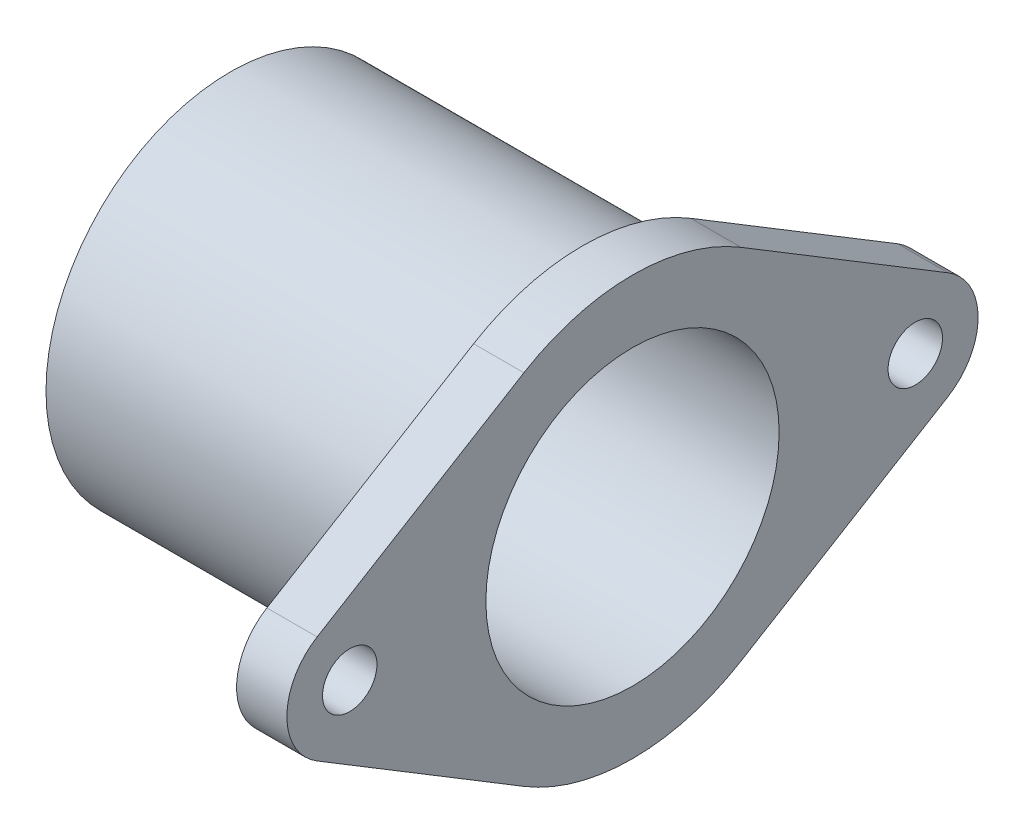
ISO-10303-21;
HEADER;
FILE_DESCRIPTION(('STEP AP214'),'2;1');
FILE_NAME('part.step','',(''),(''),'','','');
FILE_SCHEMA(('AUTOMOTIVE_DESIGN { 1 0 10303 214 1 1 1 1 }'));
ENDSEC;
DATA;
#1=APPLICATION_CONTEXT('core data for automotive mechanical design processes');
#2=APPLICATION_PROTOCOL_DEFINITION('international standard','automotive_design',2000,#1);
#3=PRODUCT_CONTEXT('',#1,'mechanical');
#4=PRODUCT('Part','Part','',(#3));
#5=PRODUCT_RELATED_PRODUCT_CATEGORY('part','',(#4));
#6=PRODUCT_DEFINITION_FORMATION('','',#4);
#7=PRODUCT_DEFINITION_CONTEXT('part definition',#1,'design');
#8=PRODUCT_DEFINITION('design','',#6,#7);
#9=PRODUCT_DEFINITION_SHAPE('','',#8);
#10=(LENGTH_UNIT() NAMED_UNIT(*) SI_UNIT(.MILLI.,.METRE.));
#11=(NAMED_UNIT(*) PLANE_ANGLE_UNIT() SI_UNIT($,.RADIAN.));
#12=(NAMED_UNIT(*) SI_UNIT($,.STERADIAN.) SOLID_ANGLE_UNIT());
#13=UNCERTAINTY_MEASURE_WITH_UNIT(LENGTH_MEASURE(1.E-05),#10,'distance_accuracy_value','');
#14=(GEOMETRIC_REPRESENTATION_CONTEXT(3) GLOBAL_UNCERTAINTY_ASSIGNED_CONTEXT((#13)) GLOBAL_UNIT_ASSIGNED_CONTEXT((#10,
#11,#12)) REPRESENTATION_CONTEXT('',''));
#15=CARTESIAN_POINT('',(0.,0.,0.));
#16=DIRECTION('',(0.,0.,1.));
#17=DIRECTION('',(1.,0.,0.));
#18=AXIS2_PLACEMENT_3D('',#15,#16,#17);
#19=CARTESIAN_POINT('',(84.,0.,0.));
#20=DIRECTION('',(-1.,0.,0.));
#21=DIRECTION('',(0.,0.,0.999999999999999));
#22=AXIS2_PLACEMENT_3D('',#19,#20,#21);
#23=CYLINDRICAL_SURFACE('',#22,44.);
#24=CARTESIAN_POINT('',(84.,0.,0.));
#25=DIRECTION('',(1.,0.,0.));
#26=DIRECTION('',(0.,0.,-0.999999999999999));
#27=AXIS2_PLACEMENT_3D('',#24,#25,#26);
#28=CIRCLE('',#27,44.);
#29=CARTESIAN_POINT('',(84.,0.,44.));
#30=VERTEX_POINT('',#29);
#31=EDGE_CURVE('E11',#30,#30,#28,.T.);
#32=CARTESIAN_POINT('',(0.,0.,0.));
#33=DIRECTION('',(1.,0.,0.));
#34=DIRECTION('',(0.,0.,-0.999999999999999));
#35=AXIS2_PLACEMENT_3D('',#32,#33,#34);
#36=CIRCLE('',#35,44.);
#37=CARTESIAN_POINT('',(0.,0.,44.));
#38=VERTEX_POINT('',#37);
#39=EDGE_CURVE('E43',#38,#38,#36,.T.);
#40=CARTESIAN_POINT('',(84.,0.,44.));
#41=CARTESIAN_POINT('',(83.125,0.,44.));
#42=CARTESIAN_POINT('',(82.25,0.,44.));
#43=CARTESIAN_POINT('',(80.5,0.,44.));
#44=CARTESIAN_POINT('',(79.625,0.,44.));
#45=CARTESIAN_POINT('',(77.875,0.,44.));
#46=CARTESIAN_POINT('',(77.,0.,44.));
#47=CARTESIAN_POINT('',(75.25,0.,44.));
#48=CARTESIAN_POINT('',(74.375,0.,44.));
#49=CARTESIAN_POINT('',(72.625,0.,44.));
#50=CARTESIAN_POINT('',(71.75,0.,44.));
#51=CARTESIAN_POINT('',(70.,0.,44.));
#52=CARTESIAN_POINT('',(69.125,0.,44.));
#53=CARTESIAN_POINT('',(67.375,0.,44.));
#54=CARTESIAN_POINT('',(66.5,0.,44.));
#55=CARTESIAN_POINT('',(64.75,0.,44.));
#56=CARTESIAN_POINT('',(63.875,0.,44.));
#57=CARTESIAN_POINT('',(62.125,0.,44.));
#58=CARTESIAN_POINT('',(61.25,0.,44.));
#59=CARTESIAN_POINT('',(59.5,0.,44.));
#60=CARTESIAN_POINT('',(58.625,0.,44.));
#61=CARTESIAN_POINT('',(56.875,0.,44.));
#62=CARTESIAN_POINT('',(56.,0.,44.));
#63=CARTESIAN_POINT('',(54.25,0.,44.));
#64=CARTESIAN_POINT('',(53.375,0.,44.));
#65=CARTESIAN_POINT('',(51.625,0.,44.));
#66=CARTESIAN_POINT('',(50.75,0.,44.));
#67=CARTESIAN_POINT('',(49.,0.,44.));
#68=CARTESIAN_POINT('',(48.125,0.,44.));
#69=CARTESIAN_POINT('',(46.375,0.,44.));
#70=CARTESIAN_POINT('',(45.5,0.,44.));
#71=CARTESIAN_POINT('',(43.75,0.,44.));
#72=CARTESIAN_POINT('',(42.875,0.,44.));
#73=CARTESIAN_POINT('',(41.125,0.,44.));
#74=CARTESIAN_POINT('',(40.25,0.,44.));
#75=CARTESIAN_POINT('',(38.5,0.,44.));
#76=CARTESIAN_POINT('',(37.625,0.,44.));
#77=CARTESIAN_POINT('',(35.875,0.,44.));
#78=CARTESIAN_POINT('',(35.,0.,44.));
#79=CARTESIAN_POINT('',(33.25,0.,44.));
#80=CARTESIAN_POINT('',(32.375,0.,44.));
#81=CARTESIAN_POINT('',(30.625,0.,44.));
#82=CARTESIAN_POINT('',(29.75,0.,44.));
#83=CARTESIAN_POINT('',(28.,0.,44.));
#84=CARTESIAN_POINT('',(27.125,0.,44.));
#85=CARTESIAN_POINT('',(25.375,0.,44.));
#86=CARTESIAN_POINT('',(24.5,0.,44.));
#87=CARTESIAN_POINT('',(22.75,0.,44.));
#88=CARTESIAN_POINT('',(21.875,0.,44.));
#89=CARTESIAN_POINT('',(20.125,0.,44.));
#90=CARTESIAN_POINT('',(19.25,0.,44.));
#91=CARTESIAN_POINT('',(17.5,0.,44.));
#92=CARTESIAN_POINT('',(16.625,0.,44.));
#93=CARTESIAN_POINT('',(14.875,0.,44.));
#94=CARTESIAN_POINT('',(14.,0.,44.));
#95=CARTESIAN_POINT('',(12.25,0.,44.));
#96=CARTESIAN_POINT('',(11.375,0.,44.));
#97=CARTESIAN_POINT('',(9.62499999999998,0.,44.));
#98=CARTESIAN_POINT('',(8.74999999999998,0.,44.));
#99=CARTESIAN_POINT('',(6.99999999999998,0.,44.));
#100=CARTESIAN_POINT('',(6.12499999999999,0.,44.));
#101=CARTESIAN_POINT('',(4.37499999999999,0.,44.));
#102=CARTESIAN_POINT('',(3.49999999999999,0.,44.));
#103=CARTESIAN_POINT('',(1.74999999999999,0.,44.));
#104=CARTESIAN_POINT('',(0.874999999999986,0.,44.));
#105=CARTESIAN_POINT('',(0.,0.,44.));
#106=B_SPLINE_CURVE_WITH_KNOTS('',3,(#40,#41,#42,#43,#44,#45,#46,#47,#48,#49,#50,#51,#52,#53,
#54,#55,#56,#57,#58,#59,#60,#61,#62,#63,#64,#65,#66,#67,#68,#69,#70,#71,#72,#73,#74,#75,#76,#77,
#78,#79,#80,#81,#82,#83,#84,#85,#86,#87,#88,#89,#90,#91,#92,#93,#94,#95,#96,#97,#98,#99,#100,
#101,#102,#103,#104,#105),.UNSPECIFIED.,.F.,.F.,(4,2,2,2,2,2,2,2,2,2,2,2,2,2,2,2,2,2,2,2,2,2,2,
2,2,2,2,2,2,2,2,2,4),(0.,2.625,5.25,7.87500000000001,10.5,13.125,15.75,18.375,21.,23.625,26.25,
28.875,31.5,34.125,36.75,39.375,42.,44.625,47.25,49.875,52.5,55.125,57.75,60.375,63.,65.625,
68.25,70.875,73.5,76.125,78.75,81.375,84.),.UNSPECIFIED.);
#107=EDGE_CURVE('BSEAM34',#30,#38,#106,.T.);
#108=ORIENTED_EDGE('',*,*,#31,.F.);
#109=ORIENTED_EDGE('',*,*,#39,.T.);
#110=ORIENTED_EDGE('',*,*,#107,.T.);
#111=ORIENTED_EDGE('',*,*,#107,.F.);
#112=EDGE_LOOP('',(#108,#110,#109,#111));
#113=FACE_BOUND('',#112,.T.);
#114=ADVANCED_FACE('F34',(#113),#23,.T.);
#115=CARTESIAN_POINT('',(0.,0.,0.));
#116=DIRECTION('',(1.,0.,0.));
#117=DIRECTION('',(0.,0.,-0.999999999999999));
#118=AXIS2_PLACEMENT_3D('',#115,#116,#117);
#119=PLANE('',#118);
#120=CARTESIAN_POINT('',(0.,0.,0.));
#121=DIRECTION('',(-1.,0.,0.));
#122=DIRECTION('',(0.,0.,0.999999999999999));
#123=AXIS2_PLACEMENT_3D('',#120,#121,#122);
#124=CIRCLE('',#123,25.25);
#125=CARTESIAN_POINT('',(0.,0.,25.25));
#126=VERTEX_POINT('',#125);
#127=EDGE_CURVE('E233',#126,#126,#124,.T.);
#128=ORIENTED_EDGE('',*,*,#127,.F.);
#129=EDGE_LOOP('',(#128));
#130=FACE_BOUND('',#129,.T.);
#131=ORIENTED_EDGE('',*,*,#39,.F.);
#132=EDGE_LOOP('',(#131));
#133=FACE_BOUND('',#132,.T.);
#134=ADVANCED_FACE('F166',(#130,#133),#119,.F.);
#135=CARTESIAN_POINT('',(84.,0.,0.));
#136=DIRECTION('',(1.,0.,0.));
#137=DIRECTION('',(0.,0.,-0.999999999999999));
#138=AXIS2_PLACEMENT_3D('',#135,#136,#137);
#139=PLANE('',#138);
#140=CARTESIAN_POINT('',(84.0000000000005,0.,67.5000000000003));
#141=DIRECTION('',(1.,0.,0.));
#142=DIRECTION('',(0.,0.,-0.999999999999999));
#143=AXIS2_PLACEMENT_3D('',#140,#141,#142);
#144=CIRCLE('',#143,6.5);
#145=CARTESIAN_POINT('',(84.0000000000005,0.,61.0000000000003));
#146=VERTEX_POINT('',#145);
#147=EDGE_CURVE('E245',#146,#146,#144,.T.);
#148=ORIENTED_EDGE('',*,*,#147,.T.);
#149=EDGE_LOOP('',(#148));
#150=FACE_BOUND('',#149,.T.);
#151=CARTESIAN_POINT('',(84.0000000000009,1.77635683940025E-12,-67.4999999999963));
#152=DIRECTION('',(1.,0.,0.));
#153=DIRECTION('',(0.,0.,-0.999999999999999));
#154=AXIS2_PLACEMENT_3D('',#151,#152,#153);
#155=CIRCLE('',#154,6.5);
#156=CARTESIAN_POINT('',(84.0000000000009,1.77635683940025E-12,-73.9999999999963));
#157=VERTEX_POINT('',#156);
#158=EDGE_CURVE('E137',#157,#157,#155,.T.);
#159=ORIENTED_EDGE('',*,*,#158,.T.);
#160=EDGE_LOOP('',(#159));
#161=FACE_BOUND('',#160,.T.);
#162=CARTESIAN_POINT('',(84.,0.,0.));
#163=DIRECTION('',(1.,0.,0.));
#164=DIRECTION('',(0.,0.,-0.999999999999999));
#165=AXIS2_PLACEMENT_3D('',#162,#163,#164);
#166=CIRCLE('',#165,50.);
#167=CARTESIAN_POINT('',(84.0000000000001,42.7533199282042,-25.9259259259226));
#168=VERTEX_POINT('',#167);
#169=CARTESIAN_POINT('',(84.0000000000004,42.7533199282046,25.9259259259292));
#170=VERTEX_POINT('',#169);
#171=EDGE_CURVE('E133',#168,#170,#166,.T.);
#172=ORIENTED_EDGE('',*,*,#171,.F.);
#173=DIRECTION('',(0.,0.518518518518517,0.855066398564088));
#174=VECTOR('',#173,1.);
#175=CARTESIAN_POINT('',(84.0000000000001,42.7533199282042,-25.9259259259226));
#176=LINE('',#175,#174);
#177=CARTESIAN_POINT('',(84.0000000000009,12.8259959784649,-75.2777777777744));
#178=VERTEX_POINT('',#177);
#179=EDGE_CURVE('E87',#178,#168,#176,.T.);
#180=ORIENTED_EDGE('',*,*,#179,.F.);
#181=CARTESIAN_POINT('',(84.0000000000009,1.77635683940025E-12,-67.4999999999963));
#182=DIRECTION('',(1.,0.,0.));
#183=DIRECTION('',(0.,0.,-0.999999999999999));
#184=AXIS2_PLACEMENT_3D('',#181,#182,#183);
#185=CIRCLE('',#184,15.);
#186=CARTESIAN_POINT('',(84.0000000000009,-12.8259959784631,-75.2777777777784));
#187=VERTEX_POINT('',#186);
#188=EDGE_CURVE('E81',#187,#178,#185,.T.);
#189=ORIENTED_EDGE('',*,*,#188,.F.);
#190=DIRECTION('',(0.,0.518518518518519,-0.855066398564088));
#191=VECTOR('',#190,1.);
#192=CARTESIAN_POINT('',(84.0000000000009,-12.8259959784631,-75.2777777777784));
#193=LINE('',#192,#191);
#194=CARTESIAN_POINT('',(84.000000000001,-42.7533199282033,-25.9259259259226));
#195=VERTEX_POINT('',#194);
#196=EDGE_CURVE('E123',#195,#187,#193,.T.);
#197=ORIENTED_EDGE('',*,*,#196,.F.);
#198=CARTESIAN_POINT('',(84.,0.,0.));
#199=DIRECTION('',(1.,0.,0.));
#200=DIRECTION('',(0.,0.,-0.999999999999999));
#201=AXIS2_PLACEMENT_3D('',#198,#199,#200);
#202=CIRCLE('',#201,50.);
#203=CARTESIAN_POINT('',(84.0000000000013,-42.7533199282024,25.9259259259292));
#204=VERTEX_POINT('',#203);
#205=EDGE_CURVE('E143',#204,#195,#202,.T.);
#206=ORIENTED_EDGE('',*,*,#205,.F.);
#207=DIRECTION('',(0.,-0.518518518518516,-0.855066398564088));
#208=VECTOR('',#207,1.);
#209=CARTESIAN_POINT('',(84.0000000000001,-12.8259959784596,75.2777777777811));
#210=LINE('',#209,#208);
#211=CARTESIAN_POINT('',(84.0000000000001,-12.8259959784596,75.2777777777811));
#212=VERTEX_POINT('',#211);
#213=EDGE_CURVE('E141',#212,#204,#210,.T.);
#214=ORIENTED_EDGE('',*,*,#213,.F.);
#215=CARTESIAN_POINT('',(84.0000000000005,0.,67.5000000000003));
#216=DIRECTION('',(1.,0.,0.));
#217=DIRECTION('',(0.,0.,-0.999999999999999));
#218=AXIS2_PLACEMENT_3D('',#215,#216,#217);
#219=CIRCLE('',#218,15.);
#220=CARTESIAN_POINT('',(84.0000000000001,12.8259959784622,75.2777777777793));
#221=VERTEX_POINT('',#220);
#222=EDGE_CURVE('E139',#221,#212,#219,.T.);
#223=ORIENTED_EDGE('',*,*,#222,.F.);
#224=DIRECTION('',(0.,-0.518518518518518,0.855066398564088));
#225=VECTOR('',#224,1.);
#226=CARTESIAN_POINT('',(84.0000000000004,42.7533199282046,25.9259259259292));
#227=LINE('',#226,#225);
#228=EDGE_CURVE('E136',#170,#221,#227,.T.);
#229=ORIENTED_EDGE('',*,*,#228,.F.);
#230=EDGE_LOOP('',(#172,#180,#189,#197,#206,#214,#223,#229));
#231=FACE_BOUND('',#230,.T.);
#232=ORIENTED_EDGE('',*,*,#31,.T.);
#233=EDGE_LOOP('',(#232));
#234=FACE_BOUND('',#233,.T.);
#235=ADVANCED_FACE('F168',(#150,#161,#231,#234),#139,.F.);
#236=CARTESIAN_POINT('',(96.,0.,0.));
#237=DIRECTION('',(-1.,0.,0.));
#238=DIRECTION('',(0.,0.,0.999999999999999));
#239=AXIS2_PLACEMENT_3D('',#236,#237,#238);
#240=CYLINDRICAL_SURFACE('',#239,50.);
#241=ORIENTED_EDGE('',*,*,#171,.T.);
#242=DIRECTION('',(-1.,0.,0.));
#243=VECTOR('',#242,1.);
#244=CARTESIAN_POINT('',(96.0000000000004,42.7533199282046,25.9259259259292));
#245=LINE('',#244,#243);
#246=CARTESIAN_POINT('',(96.0000000000004,42.7533199282046,25.9259259259292));
#247=VERTEX_POINT('',#246);
#248=EDGE_CURVE('E161',#247,#170,#245,.T.);
#249=ORIENTED_EDGE('',*,*,#248,.F.);
#250=CARTESIAN_POINT('',(96.,0.,0.));
#251=DIRECTION('',(1.,0.,0.));
#252=DIRECTION('',(0.,0.,-0.999999999999999));
#253=AXIS2_PLACEMENT_3D('',#250,#251,#252);
#254=CIRCLE('',#253,50.);
#255=CARTESIAN_POINT('',(96.0000000000004,42.7533199282042,-25.9259259259226));
#256=VERTEX_POINT('',#255);
#257=EDGE_CURVE('E148',#256,#247,#254,.T.);
#258=ORIENTED_EDGE('',*,*,#257,.F.);
#259=DIRECTION('',(-1.,0.,0.));
#260=VECTOR('',#259,1.);
#261=CARTESIAN_POINT('',(96.0000000000004,42.7533199282042,-25.9259259259226));
#262=LINE('',#261,#260);
#263=EDGE_CURVE('E129',#256,#168,#262,.T.);
#264=ORIENTED_EDGE('',*,*,#263,.T.);
#265=EDGE_LOOP('',(#241,#249,#258,#264));
#266=FACE_BOUND('',#265,.T.);
#267=ADVANCED_FACE('F174',(#266),#240,.T.);
#268=CARTESIAN_POINT('',(96.0000000000004,42.7533199282046,25.9259259259292));
#269=DIRECTION('',(0.,-0.855066398564088,-0.518518518518518));
#270=DIRECTION('',(0.,0.518518518518518,-0.855066398564088));
#271=AXIS2_PLACEMENT_3D('',#268,#269,#270);
#272=PLANE('',#271);
#273=ORIENTED_EDGE('',*,*,#228,.T.);
#274=DIRECTION('',(-1.,0.,0.));
#275=VECTOR('',#274,1.);
#276=CARTESIAN_POINT('',(95.9999999999996,12.8259959784618,75.2777777777793));
#277=LINE('',#276,#275);
#278=CARTESIAN_POINT('',(95.9999999999996,12.8259959784618,75.2777777777793));
#279=VERTEX_POINT('',#278);
#280=EDGE_CURVE('E158',#279,#221,#277,.T.);
#281=ORIENTED_EDGE('',*,*,#280,.F.);
#282=DIRECTION('',(0.,-0.518518518518518,0.855066398564088));
#283=VECTOR('',#282,1.);
#284=CARTESIAN_POINT('',(96.0000000000004,42.7533199282046,25.9259259259292));
#285=LINE('',#284,#283);
#286=EDGE_CURVE('E96',#247,#279,#285,.T.);
#287=ORIENTED_EDGE('',*,*,#286,.F.);
#288=ORIENTED_EDGE('',*,*,#248,.T.);
#289=EDGE_LOOP('',(#273,#281,#287,#288));
#290=FACE_BOUND('',#289,.T.);
#291=ADVANCED_FACE('F182',(#290),#272,.F.);
#292=CARTESIAN_POINT('',(96.0000000000005,0.,67.5000000000003));
#293=DIRECTION('',(-1.,0.,0.));
#294=DIRECTION('',(0.,0.,0.999999999999999));
#295=AXIS2_PLACEMENT_3D('',#292,#293,#294);
#296=CYLINDRICAL_SURFACE('',#295,15.);
#297=ORIENTED_EDGE('',*,*,#222,.T.);
#298=DIRECTION('',(-1.,0.,0.));
#299=VECTOR('',#298,1.);
#300=CARTESIAN_POINT('',(95.9999999999996,-12.8259959784596,75.2777777777811));
#301=LINE('',#300,#299);
#302=CARTESIAN_POINT('',(95.9999999999996,-12.8259959784596,75.2777777777811));
#303=VERTEX_POINT('',#302);
#304=EDGE_CURVE('E155',#303,#212,#301,.T.);
#305=ORIENTED_EDGE('',*,*,#304,.F.);
#306=CARTESIAN_POINT('',(96.0000000000005,0.,67.5000000000003));
#307=DIRECTION('',(1.,0.,0.));
#308=DIRECTION('',(0.,0.,-0.999999999999999));
#309=AXIS2_PLACEMENT_3D('',#306,#307,#308);
#310=CIRCLE('',#309,15.);
#311=EDGE_CURVE('E255',#279,#303,#310,.T.);
#312=ORIENTED_EDGE('',*,*,#311,.F.);
#313=ORIENTED_EDGE('',*,*,#280,.T.);
#314=EDGE_LOOP('',(#297,#305,#312,#313));
#315=FACE_BOUND('',#314,.T.);
#316=ADVANCED_FACE('F186',(#315),#296,.T.);
#317=CARTESIAN_POINT('',(95.9999999999996,-12.8259959784596,75.2777777777811));
#318=DIRECTION('',(0.,0.855066398564088,-0.518518518518516));
#319=DIRECTION('',(0.,0.518518518518517,0.855066398564088));
#320=AXIS2_PLACEMENT_3D('',#317,#318,#319);
#321=PLANE('',#320);
#322=ORIENTED_EDGE('',*,*,#213,.T.);
#323=DIRECTION('',(-1.,0.,0.));
#324=VECTOR('',#323,1.);
#325=CARTESIAN_POINT('',(96.0000000000013,-42.7533199282024,25.9259259259292));
#326=LINE('',#325,#324);
#327=CARTESIAN_POINT('',(96.0000000000013,-42.7533199282024,25.9259259259292));
#328=VERTEX_POINT('',#327);
#329=EDGE_CURVE('E152',#328,#204,#326,.T.);
#330=ORIENTED_EDGE('',*,*,#329,.F.);
#331=DIRECTION('',(0.,-0.518518518518516,-0.855066398564088));
#332=VECTOR('',#331,1.);
#333=CARTESIAN_POINT('',(95.9999999999996,-12.8259959784596,75.2777777777811));
#334=LINE('',#333,#332);
#335=EDGE_CURVE('E257',#303,#328,#334,.T.);
#336=ORIENTED_EDGE('',*,*,#335,.F.);
#337=ORIENTED_EDGE('',*,*,#304,.T.);
#338=EDGE_LOOP('',(#322,#330,#336,#337));
#339=FACE_BOUND('',#338,.T.);
#340=ADVANCED_FACE('F189',(#339),#321,.F.);
#341=CARTESIAN_POINT('',(96.,0.,0.));
#342=DIRECTION('',(-1.,0.,0.));
#343=DIRECTION('',(0.,0.,0.999999999999999));
#344=AXIS2_PLACEMENT_3D('',#341,#342,#343);
#345=CYLINDRICAL_SURFACE('',#344,50.);
#346=ORIENTED_EDGE('',*,*,#205,.T.);
#347=DIRECTION('',(-1.,0.,0.));
#348=VECTOR('',#347,1.);
#349=CARTESIAN_POINT('',(96.0000000000013,-42.7533199282033,-25.9259259259226));
#350=LINE('',#349,#348);
#351=CARTESIAN_POINT('',(96.0000000000013,-42.7533199282033,-25.9259259259226));
#352=VERTEX_POINT('',#351);
#353=EDGE_CURVE('E124',#352,#195,#350,.T.);
#354=ORIENTED_EDGE('',*,*,#353,.F.);
#355=CARTESIAN_POINT('',(96.,0.,0.));
#356=DIRECTION('',(1.,0.,0.));
#357=DIRECTION('',(0.,0.,-0.999999999999999));
#358=AXIS2_PLACEMENT_3D('',#355,#356,#357);
#359=CIRCLE('',#358,50.);
#360=EDGE_CURVE('E115',#328,#352,#359,.T.);
#361=ORIENTED_EDGE('',*,*,#360,.F.);
#362=ORIENTED_EDGE('',*,*,#329,.T.);
#363=EDGE_LOOP('',(#346,#354,#361,#362));
#364=FACE_BOUND('',#363,.T.);
#365=ADVANCED_FACE('F193',(#364),#345,.T.);
#366=CARTESIAN_POINT('',(96.0000000000004,-12.8259959784631,-75.2777777777776));
#367=DIRECTION('',(0.,0.855066398564088,0.518518518518518));
#368=DIRECTION('',(0.,-0.518518518518519,0.855066398564088));
#369=AXIS2_PLACEMENT_3D('',#366,#367,#368);
#370=PLANE('',#369);
#371=ORIENTED_EDGE('',*,*,#196,.T.);
#372=DIRECTION('',(-1.,0.,0.));
#373=VECTOR('',#372,1.);
#374=CARTESIAN_POINT('',(96.0000000000004,-12.8259959784631,-75.2777777777776));
#375=LINE('',#374,#373);
#376=CARTESIAN_POINT('',(96.0000000000004,-12.8259959784631,-75.2777777777776));
#377=VERTEX_POINT('',#376);
#378=EDGE_CURVE('E120',#377,#187,#375,.T.);
#379=ORIENTED_EDGE('',*,*,#378,.F.);
#380=DIRECTION('',(0.,0.518518518518519,-0.855066398564088));
#381=VECTOR('',#380,1.);
#382=CARTESIAN_POINT('',(96.0000000000004,-12.8259959784631,-75.2777777777776));
#383=LINE('',#382,#381);
#384=EDGE_CURVE('E109',#352,#377,#383,.T.);
#385=ORIENTED_EDGE('',*,*,#384,.F.);
#386=ORIENTED_EDGE('',*,*,#353,.T.);
#387=EDGE_LOOP('',(#371,#379,#385,#386));
#388=FACE_BOUND('',#387,.T.);
#389=ADVANCED_FACE('F121',(#388),#370,.F.);
#390=CARTESIAN_POINT('',(96.0000000000009,1.77635683940025E-12,-67.4999999999963));
#391=DIRECTION('',(-1.,0.,0.));
#392=DIRECTION('',(0.,0.,0.999999999999999));
#393=AXIS2_PLACEMENT_3D('',#390,#391,#392);
#394=CYLINDRICAL_SURFACE('',#393,15.);
#395=ORIENTED_EDGE('',*,*,#188,.T.);
#396=DIRECTION('',(-1.,0.,0.));
#397=VECTOR('',#396,1.);
#398=CARTESIAN_POINT('',(96.0000000000004,12.8259959784649,-75.2777777777744));
#399=LINE('',#398,#397);
#400=CARTESIAN_POINT('',(96.0000000000004,12.8259959784649,-75.2777777777744));
#401=VERTEX_POINT('',#400);
#402=EDGE_CURVE('E125',#401,#178,#399,.T.);
#403=ORIENTED_EDGE('',*,*,#402,.F.);
#404=CARTESIAN_POINT('',(96.0000000000009,1.77635683940025E-12,-67.4999999999963));
#405=DIRECTION('',(1.,0.,0.));
#406=DIRECTION('',(0.,0.,-0.999999999999999));
#407=AXIS2_PLACEMENT_3D('',#404,#405,#406);
#408=CIRCLE('',#407,15.);
#409=EDGE_CURVE('E113',#377,#401,#408,.T.);
#410=ORIENTED_EDGE('',*,*,#409,.F.);
#411=ORIENTED_EDGE('',*,*,#378,.T.);
#412=EDGE_LOOP('',(#395,#403,#410,#411));
#413=FACE_BOUND('',#412,.T.);
#414=ADVANCED_FACE('F127',(#413),#394,.T.);
#415=CARTESIAN_POINT('',(96.0000000000004,42.7533199282042,-25.9259259259226));
#416=DIRECTION('',(0.,-0.855066398564088,0.518518518518517));
#417=DIRECTION('',(0.,-0.518518518518517,-0.855066398564088));
#418=AXIS2_PLACEMENT_3D('',#415,#416,#417);
#419=PLANE('',#418);
#420=ORIENTED_EDGE('',*,*,#179,.T.);
#421=ORIENTED_EDGE('',*,*,#263,.F.);
#422=DIRECTION('',(0.,0.518518518518517,0.855066398564088));
#423=VECTOR('',#422,1.);
#424=CARTESIAN_POINT('',(96.0000000000004,42.7533199282042,-25.9259259259226));
#425=LINE('',#424,#423);
#426=EDGE_CURVE('E52',#401,#256,#425,.T.);
#427=ORIENTED_EDGE('',*,*,#426,.F.);
#428=ORIENTED_EDGE('',*,*,#402,.T.);
#429=EDGE_LOOP('',(#420,#421,#427,#428));
#430=FACE_BOUND('',#429,.T.);
#431=ADVANCED_FACE('F202',(#430),#419,.F.);
#432=CARTESIAN_POINT('',(96.,0.,0.));
#433=DIRECTION('',(1.,0.,0.));
#434=DIRECTION('',(0.,0.,-0.999999999999999));
#435=AXIS2_PLACEMENT_3D('',#432,#433,#434);
#436=PLANE('',#435);
#437=CARTESIAN_POINT('',(96.,0.,0.));
#438=DIRECTION('',(1.,0.,0.));
#439=DIRECTION('',(0.,0.,-0.999999999999999));
#440=AXIS2_PLACEMENT_3D('',#437,#438,#439);
#441=CIRCLE('',#440,35.);
#442=CARTESIAN_POINT('',(96.,0.,-35.));
#443=VERTEX_POINT('',#442);
#444=EDGE_CURVE('E235',#443,#443,#441,.T.);
#445=ORIENTED_EDGE('',*,*,#444,.F.);
#446=EDGE_LOOP('',(#445));
#447=FACE_BOUND('',#446,.T.);
#448=CARTESIAN_POINT('',(96.0000000000005,0.,67.5000000000003));
#449=DIRECTION('',(1.,0.,0.));
#450=DIRECTION('',(0.,0.,-0.999999999999999));
#451=AXIS2_PLACEMENT_3D('',#448,#449,#450);
#452=CIRCLE('',#451,6.5);
#453=CARTESIAN_POINT('',(96.0000000000005,0.,61.0000000000003));
#454=VERTEX_POINT('',#453);
#455=EDGE_CURVE('E240',#454,#454,#452,.T.);
#456=ORIENTED_EDGE('',*,*,#455,.F.);
#457=EDGE_LOOP('',(#456));
#458=FACE_BOUND('',#457,.T.);
#459=CARTESIAN_POINT('',(96.0000000000009,1.77635683940025E-12,-67.4999999999963));
#460=DIRECTION('',(1.,0.,0.));
#461=DIRECTION('',(0.,0.,-0.999999999999999));
#462=AXIS2_PLACEMENT_3D('',#459,#460,#461);
#463=CIRCLE('',#462,6.5);
#464=CARTESIAN_POINT('',(96.0000000000009,1.77635683940025E-12,-73.9999999999963));
#465=VERTEX_POINT('',#464);
#466=EDGE_CURVE('E248',#465,#465,#463,.T.);
#467=ORIENTED_EDGE('',*,*,#466,.F.);
#468=EDGE_LOOP('',(#467));
#469=FACE_BOUND('',#468,.T.);
#470=ORIENTED_EDGE('',*,*,#257,.T.);
#471=ORIENTED_EDGE('',*,*,#286,.T.);
#472=ORIENTED_EDGE('',*,*,#311,.T.);
#473=ORIENTED_EDGE('',*,*,#335,.T.);
#474=ORIENTED_EDGE('',*,*,#360,.T.);
#475=ORIENTED_EDGE('',*,*,#384,.T.);
#476=ORIENTED_EDGE('',*,*,#409,.T.);
#477=ORIENTED_EDGE('',*,*,#426,.T.);
#478=EDGE_LOOP('',(#470,#471,#472,#473,#474,#475,#476,#477));
#479=FACE_BOUND('',#478,.T.);
#480=ADVANCED_FACE('F111',(#447,#458,#469,#479),#436,.T.);
#481=CARTESIAN_POINT('',(16.0000000000008,1.33226762955019E-12,-67.4999999999963));
#482=DIRECTION('',(1.,0.,0.));
#483=DIRECTION('',(0.,0.,-0.999999999999999));
#484=AXIS2_PLACEMENT_3D('',#481,#482,#483);
#485=CYLINDRICAL_SURFACE('',#484,6.5);
#486=ORIENTED_EDGE('',*,*,#466,.T.);
#487=EDGE_LOOP('',(#486));
#488=FACE_BOUND('',#487,.T.);
#489=ORIENTED_EDGE('',*,*,#158,.F.);
#490=EDGE_LOOP('',(#489));
#491=FACE_BOUND('',#490,.T.);
#492=ADVANCED_FACE('F207',(#488,#491),#485,.F.);
#493=CARTESIAN_POINT('',(16.,0.,67.4999999999999));
#494=DIRECTION('',(1.,0.,0.));
#495=DIRECTION('',(0.,0.,-0.999999999999999));
#496=AXIS2_PLACEMENT_3D('',#493,#494,#495);
#497=CYLINDRICAL_SURFACE('',#496,6.5);
#498=ORIENTED_EDGE('',*,*,#455,.T.);
#499=EDGE_LOOP('',(#498));
#500=FACE_BOUND('',#499,.T.);
#501=ORIENTED_EDGE('',*,*,#147,.F.);
#502=EDGE_LOOP('',(#501));
#503=FACE_BOUND('',#502,.T.);
#504=ADVANCED_FACE('F211',(#500,#503),#497,.F.);
#505=CARTESIAN_POINT('',(11.,0.,0.));
#506=DIRECTION('',(1.,0.,0.));
#507=DIRECTION('',(0.,0.,-0.999999999999999));
#508=AXIS2_PLACEMENT_3D('',#505,#506,#507);
#509=CYLINDRICAL_SURFACE('',#508,35.);
#510=CARTESIAN_POINT('',(11.,0.,0.));
#511=DIRECTION('',(1.,0.,0.));
#512=DIRECTION('',(0.,0.,-0.999999999999999));
#513=AXIS2_PLACEMENT_3D('',#510,#511,#512);
#514=CIRCLE('',#513,35.);
#515=CARTESIAN_POINT('',(11.,0.,-35.));
#516=VERTEX_POINT('',#515);
#517=EDGE_CURVE('E237',#516,#516,#514,.T.);
#518=ORIENTED_EDGE('',*,*,#517,.F.);
#519=EDGE_LOOP('',(#518));
#520=FACE_BOUND('',#519,.T.);
#521=ORIENTED_EDGE('',*,*,#444,.T.);
#522=EDGE_LOOP('',(#521));
#523=FACE_BOUND('',#522,.T.);
#524=ADVANCED_FACE('F215',(#520,#523),#509,.F.);
#525=CARTESIAN_POINT('',(11.,0.,0.));
#526=DIRECTION('',(1.,0.,0.));
#527=DIRECTION('',(0.,0.,-0.999999999999999));
#528=AXIS2_PLACEMENT_3D('',#525,#526,#527);
#529=PLANE('',#528);
#530=CARTESIAN_POINT('',(11.,0.,0.));
#531=DIRECTION('',(1.,0.,0.));
#532=DIRECTION('',(0.,0.,-0.999999999999999));
#533=AXIS2_PLACEMENT_3D('',#530,#531,#532);
#534=CIRCLE('',#533,25.25);
#535=CARTESIAN_POINT('',(11.,0.,-25.25));
#536=VERTEX_POINT('',#535);
#537=EDGE_CURVE('E37',#536,#536,#534,.T.);
#538=ORIENTED_EDGE('',*,*,#537,.F.);
#539=EDGE_LOOP('',(#538));
#540=FACE_BOUND('',#539,.T.);
#541=ORIENTED_EDGE('',*,*,#517,.T.);
#542=EDGE_LOOP('',(#541));
#543=FACE_BOUND('',#542,.T.);
#544=ADVANCED_FACE('F219',(#540,#543),#529,.T.);
#545=CARTESIAN_POINT('',(85.,0.,0.));
#546=DIRECTION('',(-1.,0.,0.));
#547=DIRECTION('',(0.,0.,0.999999999999999));
#548=AXIS2_PLACEMENT_3D('',#545,#546,#547);
#549=CYLINDRICAL_SURFACE('',#548,25.25);
#550=ORIENTED_EDGE('',*,*,#537,.T.);
#551=EDGE_LOOP('',(#550));
#552=FACE_BOUND('',#551,.T.);
#553=ORIENTED_EDGE('',*,*,#127,.T.);
#554=EDGE_LOOP('',(#553));
#555=FACE_BOUND('',#554,.T.);
#556=ADVANCED_FACE('F223',(#552,#555),#549,.F.);
#557=CLOSED_SHELL('',(#114,#134,#235,#267,#291,#316,#340,#365,#389,#414,#431,#480,#492,#504,
#524,#544,#556));
#558=MANIFOLD_SOLID_BREP('B2',#557);
#559=ADVANCED_BREP_SHAPE_REPRESENTATION('',(#18,#558),#14);
#560=SHAPE_DEFINITION_REPRESENTATION(#9,#559);
ENDSEC;
END-ISO-10303-21;
